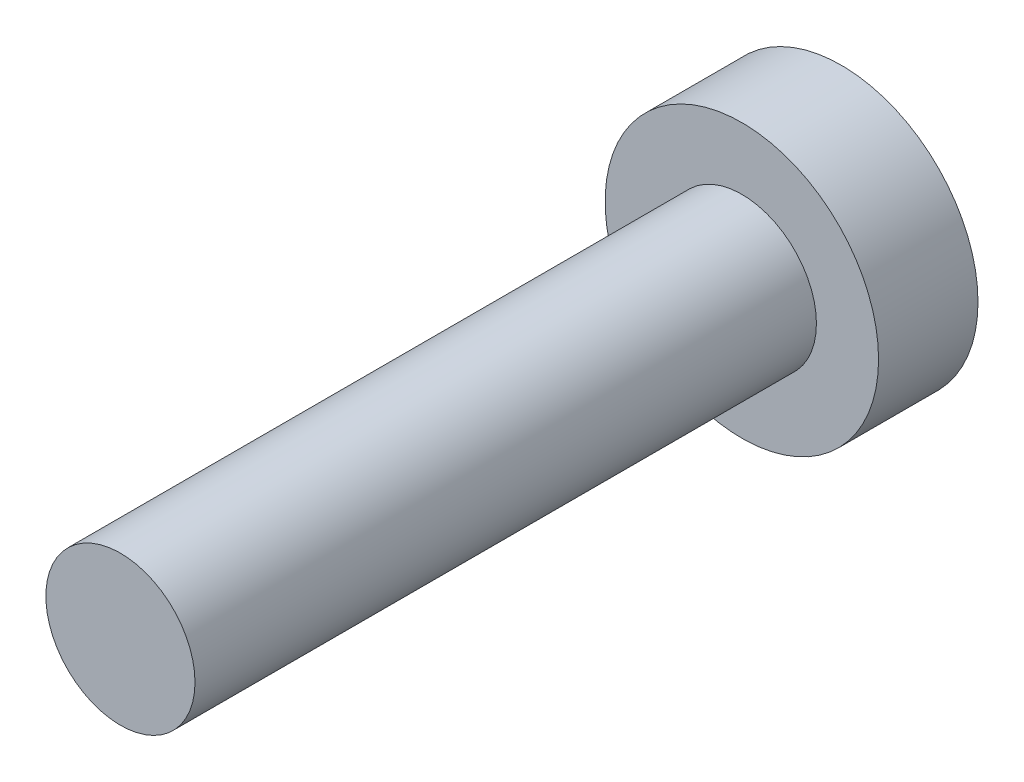
ISO-10303-21;
HEADER;
FILE_DESCRIPTION(('STEP AP214'),'2;1');
FILE_NAME('part.step','',(''),(''),'','','');
FILE_SCHEMA(('AUTOMOTIVE_DESIGN { 1 0 10303 214 1 1 1 1 }'));
ENDSEC;
DATA;
#1=APPLICATION_CONTEXT('core data for automotive mechanical design processes');
#2=APPLICATION_PROTOCOL_DEFINITION('international standard','automotive_design',2000,#1);
#3=PRODUCT_CONTEXT('',#1,'mechanical');
#4=PRODUCT('Part','Part','',(#3));
#5=PRODUCT_RELATED_PRODUCT_CATEGORY('part','',(#4));
#6=PRODUCT_DEFINITION_FORMATION('','',#4);
#7=PRODUCT_DEFINITION_CONTEXT('part definition',#1,'design');
#8=PRODUCT_DEFINITION('design','',#6,#7);
#9=PRODUCT_DEFINITION_SHAPE('','',#8);
#10=(LENGTH_UNIT() NAMED_UNIT(*) SI_UNIT(.MILLI.,.METRE.));
#11=(NAMED_UNIT(*) PLANE_ANGLE_UNIT() SI_UNIT($,.RADIAN.));
#12=(NAMED_UNIT(*) SI_UNIT($,.STERADIAN.) SOLID_ANGLE_UNIT());
#13=UNCERTAINTY_MEASURE_WITH_UNIT(LENGTH_MEASURE(1.E-05),#10,'distance_accuracy_value','');
#14=(GEOMETRIC_REPRESENTATION_CONTEXT(3) GLOBAL_UNCERTAINTY_ASSIGNED_CONTEXT((#13)) GLOBAL_UNIT_ASSIGNED_CONTEXT((#10,
#11,#12)) REPRESENTATION_CONTEXT('',''));
#15=CARTESIAN_POINT('',(0.,0.,0.));
#16=DIRECTION('',(0.,0.,1.));
#17=DIRECTION('',(1.,0.,0.));
#18=AXIS2_PLACEMENT_3D('',#15,#16,#17);
#19=CARTESIAN_POINT('',(35.708348754,-12.,21.5));
#20=DIRECTION('',(0.,0.,-1.));
#21=DIRECTION('',(-1.,0.,0.));
#22=AXIS2_PLACEMENT_3D('',#19,#20,#21);
#23=CYLINDRICAL_SURFACE('',#22,1.5);
#24=CARTESIAN_POINT('',(35.708348754,-12.,21.5));
#25=DIRECTION('',(0.,0.,1.));
#26=DIRECTION('',(1.,0.,0.));
#27=AXIS2_PLACEMENT_3D('',#24,#25,#26);
#28=CIRCLE('',#27,1.5);
#29=CARTESIAN_POINT('',(37.208348754,-12.,21.5));
#30=VERTEX_POINT('',#29);
#31=EDGE_CURVE('E10',#30,#30,#28,.T.);
#32=ORIENTED_EDGE('',*,*,#31,.F.);
#33=EDGE_LOOP('',(#32));
#34=FACE_BOUND('',#33,.T.);
#35=CARTESIAN_POINT('',(35.708348754,-12.,9.));
#36=DIRECTION('',(0.,0.,1.));
#37=DIRECTION('',(1.,0.,0.));
#38=AXIS2_PLACEMENT_3D('',#35,#36,#37);
#39=CIRCLE('',#38,1.5);
#40=CARTESIAN_POINT('',(37.208348754,-12.,9.));
#41=VERTEX_POINT('',#40);
#42=EDGE_CURVE('E45',#41,#41,#39,.T.);
#43=ORIENTED_EDGE('',*,*,#42,.T.);
#44=EDGE_LOOP('',(#43));
#45=FACE_BOUND('',#44,.T.);
#46=ADVANCED_FACE('F39',(#34,#45),#23,.T.);
#47=CARTESIAN_POINT('',(35.708348754,-12.,21.5));
#48=DIRECTION('',(0.,0.,1.));
#49=DIRECTION('',(1.,0.,0.));
#50=AXIS2_PLACEMENT_3D('',#47,#48,#49);
#51=PLANE('',#50);
#52=ORIENTED_EDGE('',*,*,#31,.T.);
#53=EDGE_LOOP('',(#52));
#54=FACE_BOUND('',#53,.T.);
#55=ADVANCED_FACE('F62',(#54),#51,.T.);
#56=CARTESIAN_POINT('',(35.708348754,-12.,9.));
#57=DIRECTION('',(0.,0.,-1.));
#58=DIRECTION('',(-1.,0.,0.));
#59=AXIS2_PLACEMENT_3D('',#56,#57,#58);
#60=CYLINDRICAL_SURFACE('',#59,2.75);
#61=CARTESIAN_POINT('',(35.708348754,-12.,9.));
#62=DIRECTION('',(0.,0.,1.));
#63=DIRECTION('',(1.,0.,0.));
#64=AXIS2_PLACEMENT_3D('',#61,#62,#63);
#65=CIRCLE('',#64,2.75);
#66=CARTESIAN_POINT('',(38.458348754,-12.,9.));
#67=VERTEX_POINT('',#66);
#68=EDGE_CURVE('E47',#67,#67,#65,.T.);
#69=ORIENTED_EDGE('',*,*,#68,.F.);
#70=EDGE_LOOP('',(#69));
#71=FACE_BOUND('',#70,.T.);
#72=CARTESIAN_POINT('',(35.708348754,-12.,7.));
#73=DIRECTION('',(0.,0.,1.));
#74=DIRECTION('',(1.,0.,0.));
#75=AXIS2_PLACEMENT_3D('',#72,#73,#74);
#76=CIRCLE('',#75,2.75);
#77=CARTESIAN_POINT('',(38.458348754,-12.,7.));
#78=VERTEX_POINT('',#77);
#79=EDGE_CURVE('E51',#78,#78,#76,.T.);
#80=ORIENTED_EDGE('',*,*,#79,.T.);
#81=EDGE_LOOP('',(#80));
#82=FACE_BOUND('',#81,.T.);
#83=ADVANCED_FACE('F56',(#71,#82),#60,.T.);
#84=CARTESIAN_POINT('',(35.708348754,-12.,9.));
#85=DIRECTION('',(0.,0.,1.));
#86=DIRECTION('',(1.,0.,0.));
#87=AXIS2_PLACEMENT_3D('',#84,#85,#86);
#88=PLANE('',#87);
#89=ORIENTED_EDGE('',*,*,#42,.F.);
#90=EDGE_LOOP('',(#89));
#91=FACE_BOUND('',#90,.T.);
#92=ORIENTED_EDGE('',*,*,#68,.T.);
#93=EDGE_LOOP('',(#92));
#94=FACE_BOUND('',#93,.T.);
#95=ADVANCED_FACE('F60',(#91,#94),#88,.T.);
#96=CARTESIAN_POINT('',(35.708348754,-12.,7.));
#97=DIRECTION('',(0.,0.,1.));
#98=DIRECTION('',(1.,0.,0.));
#99=AXIS2_PLACEMENT_3D('',#96,#97,#98);
#100=PLANE('',#99);
#101=ORIENTED_EDGE('',*,*,#79,.F.);
#102=EDGE_LOOP('',(#101));
#103=FACE_BOUND('',#102,.T.);
#104=ADVANCED_FACE('F66',(#103),#100,.F.);
#105=CLOSED_SHELL('',(#46,#55,#83,#95,#104));
#106=MANIFOLD_SOLID_BREP('B2',#105);
#107=ADVANCED_BREP_SHAPE_REPRESENTATION('',(#18,#106),#14);
#108=SHAPE_DEFINITION_REPRESENTATION(#9,#107);
ENDSEC;
END-ISO-10303-21;
